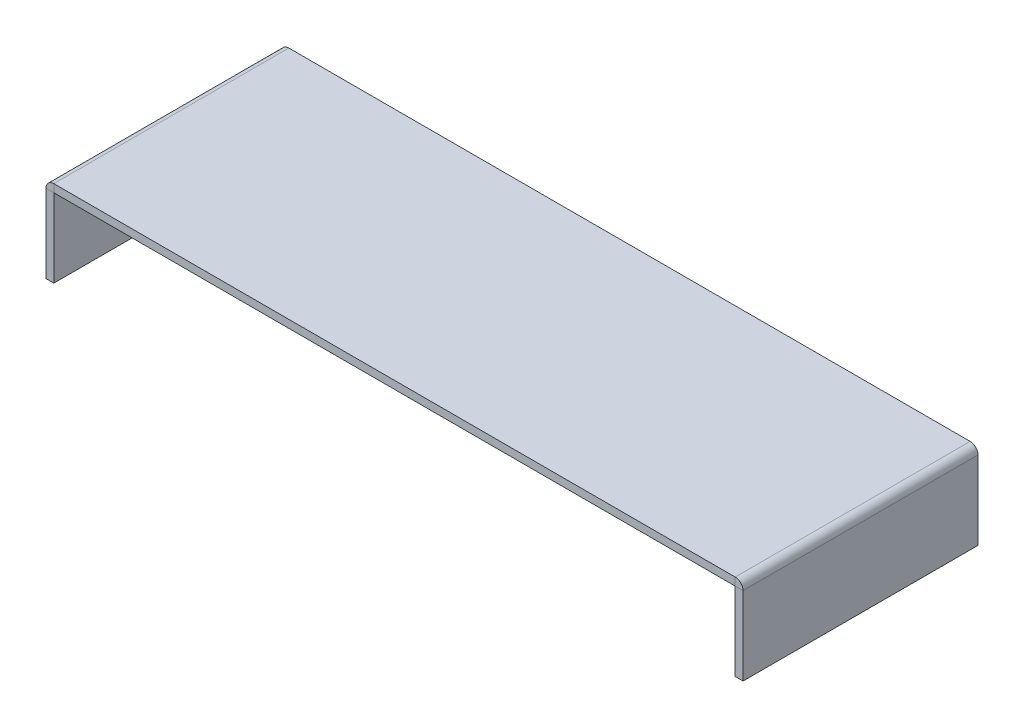
ISO-10303-21;
HEADER;
FILE_DESCRIPTION(('STEP AP214'),'2;1');
FILE_NAME('part.step','',(''),(''),'','','');
FILE_SCHEMA(('AUTOMOTIVE_DESIGN { 1 0 10303 214 1 1 1 1 }'));
ENDSEC;
DATA;
#1=APPLICATION_CONTEXT('core data for automotive mechanical design processes');
#2=APPLICATION_PROTOCOL_DEFINITION('international standard','automotive_design',2000,#1);
#3=PRODUCT_CONTEXT('',#1,'mechanical');
#4=PRODUCT('Part','Part','',(#3));
#5=PRODUCT_RELATED_PRODUCT_CATEGORY('part','',(#4));
#6=PRODUCT_DEFINITION_FORMATION('','',#4);
#7=PRODUCT_DEFINITION_CONTEXT('part definition',#1,'design');
#8=PRODUCT_DEFINITION('design','',#6,#7);
#9=PRODUCT_DEFINITION_SHAPE('','',#8);
#10=(LENGTH_UNIT() NAMED_UNIT(*) SI_UNIT(.MILLI.,.METRE.));
#11=(NAMED_UNIT(*) PLANE_ANGLE_UNIT() SI_UNIT($,.RADIAN.));
#12=(NAMED_UNIT(*) SI_UNIT($,.STERADIAN.) SOLID_ANGLE_UNIT());
#13=UNCERTAINTY_MEASURE_WITH_UNIT(LENGTH_MEASURE(1.E-05),#10,'distance_accuracy_value','');
#14=(GEOMETRIC_REPRESENTATION_CONTEXT(3) GLOBAL_UNCERTAINTY_ASSIGNED_CONTEXT((#13)) GLOBAL_UNIT_ASSIGNED_CONTEXT((#10,
#11,#12)) REPRESENTATION_CONTEXT('',''));
#15=CARTESIAN_POINT('',(0.,0.,0.));
#16=DIRECTION('',(0.,0.,1.));
#17=DIRECTION('',(1.,0.,0.));
#18=AXIS2_PLACEMENT_3D('',#15,#16,#17);
#19=CARTESIAN_POINT('',(43.5,0.,-15.));
#20=DIRECTION('',(0.,0.,-1.));
#21=DIRECTION('',(-1.,0.,0.));
#22=AXIS2_PLACEMENT_3D('',#19,#20,#21);
#23=PLANE('',#22);
#24=DIRECTION('',(0.,1.,0.));
#25=VECTOR('',#24,1.);
#26=CARTESIAN_POINT('',(43.5,0.,-15.));
#27=LINE('',#26,#25);
#28=CARTESIAN_POINT('',(43.5,0.,-15.));
#29=VERTEX_POINT('',#28);
#30=CARTESIAN_POINT('',(43.5,1.,-15.));
#31=VERTEX_POINT('',#30);
#32=EDGE_CURVE('E11',#29,#31,#27,.T.);
#33=ORIENTED_EDGE('',*,*,#32,.F.);
#34=DIRECTION('',(1.,0.,0.));
#35=VECTOR('',#34,1.);
#36=CARTESIAN_POINT('',(-43.5,0.,-15.));
#37=LINE('',#36,#35);
#38=CARTESIAN_POINT('',(-43.5,0.,-15.));
#39=VERTEX_POINT('',#38);
#40=EDGE_CURVE('E119',#39,#29,#37,.T.);
#41=ORIENTED_EDGE('',*,*,#40,.F.);
#42=DIRECTION('',(0.,1.,0.));
#43=VECTOR('',#42,1.);
#44=CARTESIAN_POINT('',(-43.5,0.,-15.));
#45=LINE('',#44,#43);
#46=CARTESIAN_POINT('',(-43.5,1.,-15.));
#47=VERTEX_POINT('',#46);
#48=EDGE_CURVE('E207',#39,#47,#45,.T.);
#49=ORIENTED_EDGE('',*,*,#48,.T.);
#50=DIRECTION('',(1.,0.,0.));
#51=VECTOR('',#50,1.);
#52=CARTESIAN_POINT('',(-43.5,1.,-15.));
#53=LINE('',#52,#51);
#54=EDGE_CURVE('E159',#47,#31,#53,.T.);
#55=ORIENTED_EDGE('',*,*,#54,.T.);
#56=EDGE_LOOP('',(#33,#41,#49,#55));
#57=FACE_BOUND('',#56,.T.);
#58=ADVANCED_FACE('F35',(#57),#23,.T.);
#59=CARTESIAN_POINT('',(43.5,0.,-15.));
#60=DIRECTION('',(0.,0.,-1.));
#61=DIRECTION('',(-1.,0.,0.));
#62=AXIS2_PLACEMENT_3D('',#59,#60,#61);
#63=PLANE('',#62);
#64=DIRECTION('',(1.,0.,0.));
#65=VECTOR('',#64,1.);
#66=CARTESIAN_POINT('',(43.5,0.,-15.));
#67=LINE('',#66,#65);
#68=CARTESIAN_POINT('',(44.5,0.,-15.));
#69=VERTEX_POINT('',#68);
#70=EDGE_CURVE('E42',#29,#69,#67,.T.);
#71=ORIENTED_EDGE('',*,*,#70,.F.);
#72=ORIENTED_EDGE('',*,*,#32,.T.);
#73=CARTESIAN_POINT('',(43.5,0.,-15.));
#74=DIRECTION('',(0.,0.,-1.));
#75=DIRECTION('',(-1.,0.,0.));
#76=AXIS2_PLACEMENT_3D('',#73,#74,#75);
#77=CIRCLE('',#76,1.);
#78=EDGE_CURVE('E184',#31,#69,#77,.T.);
#79=ORIENTED_EDGE('',*,*,#78,.T.);
#80=EDGE_LOOP('',(#71,#72,#79));
#81=FACE_BOUND('',#80,.T.);
#82=ADVANCED_FACE('F218',(#81),#63,.T.);
#83=CARTESIAN_POINT('',(43.5,0.,15.));
#84=DIRECTION('',(0.,0.,1.));
#85=DIRECTION('',(1.,0.,0.));
#86=AXIS2_PLACEMENT_3D('',#83,#84,#85);
#87=PLANE('',#86);
#88=DIRECTION('',(1.,0.,0.));
#89=VECTOR('',#88,1.);
#90=CARTESIAN_POINT('',(43.5,0.,15.));
#91=LINE('',#90,#89);
#92=CARTESIAN_POINT('',(43.5,0.,15.));
#93=VERTEX_POINT('',#92);
#94=CARTESIAN_POINT('',(44.5,0.,15.));
#95=VERTEX_POINT('',#94);
#96=EDGE_CURVE('E49',#93,#95,#91,.T.);
#97=ORIENTED_EDGE('',*,*,#96,.F.);
#98=DIRECTION('',(0.,-1.,0.));
#99=VECTOR('',#98,1.);
#100=CARTESIAN_POINT('',(43.5,0.,15.));
#101=LINE('',#100,#99);
#102=CARTESIAN_POINT('',(43.5,-10.,15.));
#103=VERTEX_POINT('',#102);
#104=EDGE_CURVE('E111',#93,#103,#101,.T.);
#105=ORIENTED_EDGE('',*,*,#104,.T.);
#106=DIRECTION('',(-1.,0.,0.));
#107=VECTOR('',#106,1.);
#108=CARTESIAN_POINT('',(44.5,-10.,15.));
#109=LINE('',#108,#107);
#110=CARTESIAN_POINT('',(44.5,-10.,15.));
#111=VERTEX_POINT('',#110);
#112=EDGE_CURVE('E116',#111,#103,#109,.T.);
#113=ORIENTED_EDGE('',*,*,#112,.F.);
#114=DIRECTION('',(0.,1.,0.));
#115=VECTOR('',#114,1.);
#116=CARTESIAN_POINT('',(44.5,0.,15.));
#117=LINE('',#116,#115);
#118=EDGE_CURVE('E135',#95,#111,#117,.F.);
#119=ORIENTED_EDGE('',*,*,#118,.F.);
#120=EDGE_LOOP('',(#97,#105,#113,#119));
#121=FACE_BOUND('',#120,.T.);
#122=ADVANCED_FACE('F113',(#121),#87,.T.);
#123=CARTESIAN_POINT('',(43.5,0.,15.));
#124=DIRECTION('',(0.,0.,1.));
#125=DIRECTION('',(1.,0.,0.));
#126=AXIS2_PLACEMENT_3D('',#123,#124,#125);
#127=PLANE('',#126);
#128=DIRECTION('',(0.,1.,0.));
#129=VECTOR('',#128,1.);
#130=CARTESIAN_POINT('',(43.5,0.,15.));
#131=LINE('',#130,#129);
#132=CARTESIAN_POINT('',(43.5,1.,15.));
#133=VERTEX_POINT('',#132);
#134=EDGE_CURVE('E56',#93,#133,#131,.T.);
#135=ORIENTED_EDGE('',*,*,#134,.F.);
#136=ORIENTED_EDGE('',*,*,#96,.T.);
#137=CARTESIAN_POINT('',(43.5,0.,15.));
#138=DIRECTION('',(0.,0.,-1.));
#139=DIRECTION('',(-1.,0.,0.));
#140=AXIS2_PLACEMENT_3D('',#137,#138,#139);
#141=CIRCLE('',#140,1.);
#142=EDGE_CURVE('E196',#95,#133,#141,.F.);
#143=ORIENTED_EDGE('',*,*,#142,.T.);
#144=EDGE_LOOP('',(#135,#136,#143));
#145=FACE_BOUND('',#144,.T.);
#146=ADVANCED_FACE('F226',(#145),#127,.T.);
#147=CARTESIAN_POINT('',(-43.5,0.,-15.));
#148=DIRECTION('',(0.,0.,-1.));
#149=DIRECTION('',(-1.,0.,0.));
#150=AXIS2_PLACEMENT_3D('',#147,#148,#149);
#151=PLANE('',#150);
#152=DIRECTION('',(-1.,0.,0.));
#153=VECTOR('',#152,1.);
#154=CARTESIAN_POINT('',(-43.5,0.,-15.));
#155=LINE('',#154,#153);
#156=CARTESIAN_POINT('',(-44.5,0.,-15.));
#157=VERTEX_POINT('',#156);
#158=EDGE_CURVE('E209',#39,#157,#155,.T.);
#159=ORIENTED_EDGE('',*,*,#158,.F.);
#160=DIRECTION('',(0.,1.,0.));
#161=VECTOR('',#160,1.);
#162=CARTESIAN_POINT('',(-43.5,0.,-15.));
#163=LINE('',#162,#161);
#164=CARTESIAN_POINT('',(-43.5,-10.,-15.));
#165=VERTEX_POINT('',#164);
#166=EDGE_CURVE('E168',#165,#39,#163,.T.);
#167=ORIENTED_EDGE('',*,*,#166,.F.);
#168=DIRECTION('',(-1.,0.,0.));
#169=VECTOR('',#168,1.);
#170=CARTESIAN_POINT('',(-43.5,-10.,-15.));
#171=LINE('',#170,#169);
#172=CARTESIAN_POINT('',(-44.5,-10.,-15.));
#173=VERTEX_POINT('',#172);
#174=EDGE_CURVE('E165',#165,#173,#171,.T.);
#175=ORIENTED_EDGE('',*,*,#174,.T.);
#176=DIRECTION('',(0.,1.,0.));
#177=VECTOR('',#176,1.);
#178=CARTESIAN_POINT('',(-44.5,0.,-15.));
#179=LINE('',#178,#177);
#180=EDGE_CURVE('E162',#173,#157,#179,.T.);
#181=ORIENTED_EDGE('',*,*,#180,.T.);
#182=EDGE_LOOP('',(#159,#167,#175,#181));
#183=FACE_BOUND('',#182,.T.);
#184=ADVANCED_FACE('F265',(#183),#151,.T.);
#185=CARTESIAN_POINT('',(-43.5,0.,-15.));
#186=DIRECTION('',(0.,0.,-1.));
#187=DIRECTION('',(-1.,0.,0.));
#188=AXIS2_PLACEMENT_3D('',#185,#186,#187);
#189=PLANE('',#188);
#190=ORIENTED_EDGE('',*,*,#48,.F.);
#191=ORIENTED_EDGE('',*,*,#158,.T.);
#192=CARTESIAN_POINT('',(-43.5,0.,-15.));
#193=DIRECTION('',(0.,0.,-1.));
#194=DIRECTION('',(-1.,0.,0.));
#195=AXIS2_PLACEMENT_3D('',#192,#193,#194);
#196=CIRCLE('',#195,1.);
#197=EDGE_CURVE('E187',#157,#47,#196,.T.);
#198=ORIENTED_EDGE('',*,*,#197,.T.);
#199=EDGE_LOOP('',(#190,#191,#198));
#200=FACE_BOUND('',#199,.T.);
#201=ADVANCED_FACE('F263',(#200),#189,.T.);
#202=CARTESIAN_POINT('',(-43.5,0.,15.));
#203=DIRECTION('',(0.,0.,1.));
#204=DIRECTION('',(1.,0.,0.));
#205=AXIS2_PLACEMENT_3D('',#202,#203,#204);
#206=PLANE('',#205);
#207=DIRECTION('',(0.,1.,0.));
#208=VECTOR('',#207,1.);
#209=CARTESIAN_POINT('',(-43.5,0.,15.));
#210=LINE('',#209,#208);
#211=CARTESIAN_POINT('',(-43.5,0.,15.));
#212=VERTEX_POINT('',#211);
#213=CARTESIAN_POINT('',(-43.5,1.,15.));
#214=VERTEX_POINT('',#213);
#215=EDGE_CURVE('E205',#212,#214,#210,.T.);
#216=ORIENTED_EDGE('',*,*,#215,.F.);
#217=DIRECTION('',(1.,0.,0.));
#218=VECTOR('',#217,1.);
#219=CARTESIAN_POINT('',(-43.5,0.,15.));
#220=LINE('',#219,#218);
#221=EDGE_CURVE('E151',#212,#93,#220,.T.);
#222=ORIENTED_EDGE('',*,*,#221,.T.);
#223=ORIENTED_EDGE('',*,*,#134,.T.);
#224=DIRECTION('',(1.,0.,0.));
#225=VECTOR('',#224,1.);
#226=CARTESIAN_POINT('',(-43.5,1.,15.));
#227=LINE('',#226,#225);
#228=EDGE_CURVE('E137',#214,#133,#227,.T.);
#229=ORIENTED_EDGE('',*,*,#228,.F.);
#230=EDGE_LOOP('',(#216,#222,#223,#229));
#231=FACE_BOUND('',#230,.T.);
#232=ADVANCED_FACE('F232',(#231),#206,.T.);
#233=CARTESIAN_POINT('',(-43.5,0.,15.));
#234=DIRECTION('',(0.,0.,1.));
#235=DIRECTION('',(1.,0.,0.));
#236=AXIS2_PLACEMENT_3D('',#233,#234,#235);
#237=PLANE('',#236);
#238=DIRECTION('',(-1.,0.,0.));
#239=VECTOR('',#238,1.);
#240=CARTESIAN_POINT('',(-43.5,0.,15.));
#241=LINE('',#240,#239);
#242=CARTESIAN_POINT('',(-44.5,0.,15.));
#243=VERTEX_POINT('',#242);
#244=EDGE_CURVE('E203',#212,#243,#241,.T.);
#245=ORIENTED_EDGE('',*,*,#244,.F.);
#246=ORIENTED_EDGE('',*,*,#215,.T.);
#247=CARTESIAN_POINT('',(-43.5,0.,15.));
#248=DIRECTION('',(0.,0.,-1.));
#249=DIRECTION('',(-1.,0.,0.));
#250=AXIS2_PLACEMENT_3D('',#247,#248,#249);
#251=CIRCLE('',#250,1.);
#252=EDGE_CURVE('E198',#214,#243,#251,.F.);
#253=ORIENTED_EDGE('',*,*,#252,.T.);
#254=EDGE_LOOP('',(#245,#246,#253));
#255=FACE_BOUND('',#254,.T.);
#256=ADVANCED_FACE('F239',(#255),#237,.T.);
#257=CARTESIAN_POINT('',(43.5,0.,15.));
#258=DIRECTION('',(1.,0.,0.));
#259=DIRECTION('',(0.,0.,-1.));
#260=AXIS2_PLACEMENT_3D('',#257,#258,#259);
#261=PLANE('',#260);
#262=DIRECTION('',(0.,-1.,0.));
#263=VECTOR('',#262,1.);
#264=CARTESIAN_POINT('',(43.5,0.,-15.));
#265=LINE('',#264,#263);
#266=CARTESIAN_POINT('',(43.5,-10.,-15.));
#267=VERTEX_POINT('',#266);
#268=EDGE_CURVE('E125',#29,#267,#265,.T.);
#269=ORIENTED_EDGE('',*,*,#268,.T.);
#270=DIRECTION('',(0.,0.,-1.));
#271=VECTOR('',#270,1.);
#272=CARTESIAN_POINT('',(43.5,-10.,15.));
#273=LINE('',#272,#271);
#274=EDGE_CURVE('E122',#103,#267,#273,.T.);
#275=ORIENTED_EDGE('',*,*,#274,.F.);
#276=ORIENTED_EDGE('',*,*,#104,.F.);
#277=DIRECTION('',(0.,0.,-1.));
#278=VECTOR('',#277,1.);
#279=CARTESIAN_POINT('',(43.5,0.,15.));
#280=LINE('',#279,#278);
#281=EDGE_CURVE('E153',#93,#29,#280,.T.);
#282=ORIENTED_EDGE('',*,*,#281,.T.);
#283=EDGE_LOOP('',(#269,#275,#276,#282));
#284=FACE_BOUND('',#283,.T.);
#285=ADVANCED_FACE('F123',(#284),#261,.F.);
#286=CARTESIAN_POINT('',(44.5,-10.,15.));
#287=DIRECTION('',(0.,-1.,0.));
#288=DIRECTION('',(0.,0.,-1.));
#289=AXIS2_PLACEMENT_3D('',#286,#287,#288);
#290=PLANE('',#289);
#291=DIRECTION('',(-1.,0.,0.));
#292=VECTOR('',#291,1.);
#293=CARTESIAN_POINT('',(44.5,-10.,-15.));
#294=LINE('',#293,#292);
#295=CARTESIAN_POINT('',(44.5,-10.,-15.));
#296=VERTEX_POINT('',#295);
#297=EDGE_CURVE('E155',#296,#267,#294,.T.);
#298=ORIENTED_EDGE('',*,*,#297,.F.);
#299=DIRECTION('',(0.,0.,-1.));
#300=VECTOR('',#299,1.);
#301=CARTESIAN_POINT('',(44.5,-10.,15.));
#302=LINE('',#301,#300);
#303=EDGE_CURVE('E130',#111,#296,#302,.T.);
#304=ORIENTED_EDGE('',*,*,#303,.F.);
#305=ORIENTED_EDGE('',*,*,#112,.T.);
#306=ORIENTED_EDGE('',*,*,#274,.T.);
#307=EDGE_LOOP('',(#298,#304,#305,#306));
#308=FACE_BOUND('',#307,.T.);
#309=ADVANCED_FACE('F133',(#308),#290,.T.);
#310=CARTESIAN_POINT('',(44.5,0.,15.));
#311=DIRECTION('',(1.,0.,0.));
#312=DIRECTION('',(0.,0.,-1.));
#313=AXIS2_PLACEMENT_3D('',#310,#311,#312);
#314=PLANE('',#313);
#315=DIRECTION('',(0.,1.,0.));
#316=VECTOR('',#315,1.);
#317=CARTESIAN_POINT('',(44.5,0.,-15.));
#318=LINE('',#317,#316);
#319=EDGE_CURVE('E157',#69,#296,#318,.F.);
#320=ORIENTED_EDGE('',*,*,#319,.F.);
#321=DIRECTION('',(0.,0.,-1.));
#322=VECTOR('',#321,1.);
#323=CARTESIAN_POINT('',(44.5,0.,15.));
#324=LINE('',#323,#322);
#325=EDGE_CURVE('E201',#69,#95,#324,.F.);
#326=ORIENTED_EDGE('',*,*,#325,.T.);
#327=ORIENTED_EDGE('',*,*,#118,.T.);
#328=ORIENTED_EDGE('',*,*,#303,.T.);
#329=EDGE_LOOP('',(#320,#326,#327,#328));
#330=FACE_BOUND('',#329,.T.);
#331=ADVANCED_FACE('F223',(#330),#314,.T.);
#332=CARTESIAN_POINT('',(-43.5,1.,15.));
#333=DIRECTION('',(0.,1.,0.));
#334=DIRECTION('',(0.,0.,1.));
#335=AXIS2_PLACEMENT_3D('',#332,#333,#334);
#336=PLANE('',#335);
#337=ORIENTED_EDGE('',*,*,#54,.F.);
#338=DIRECTION('',(0.,0.,-1.));
#339=VECTOR('',#338,1.);
#340=CARTESIAN_POINT('',(-43.5,1.,15.));
#341=LINE('',#340,#339);
#342=EDGE_CURVE('E193',#47,#214,#341,.F.);
#343=ORIENTED_EDGE('',*,*,#342,.T.);
#344=ORIENTED_EDGE('',*,*,#228,.T.);
#345=DIRECTION('',(0.,0.,-1.));
#346=VECTOR('',#345,1.);
#347=CARTESIAN_POINT('',(43.5,1.,15.));
#348=LINE('',#347,#346);
#349=EDGE_CURVE('E190',#133,#31,#348,.T.);
#350=ORIENTED_EDGE('',*,*,#349,.T.);
#351=EDGE_LOOP('',(#337,#343,#344,#350));
#352=FACE_BOUND('',#351,.T.);
#353=ADVANCED_FACE('F229',(#352),#336,.T.);
#354=CARTESIAN_POINT('',(-44.5,0.,15.));
#355=DIRECTION('',(-1.,0.,0.));
#356=DIRECTION('',(0.,0.,1.));
#357=AXIS2_PLACEMENT_3D('',#354,#355,#356);
#358=PLANE('',#357);
#359=DIRECTION('',(0.,1.,0.));
#360=VECTOR('',#359,1.);
#361=CARTESIAN_POINT('',(-44.5,0.,15.));
#362=LINE('',#361,#360);
#363=CARTESIAN_POINT('',(-44.5,-10.,15.));
#364=VERTEX_POINT('',#363);
#365=EDGE_CURVE('E142',#364,#243,#362,.T.);
#366=ORIENTED_EDGE('',*,*,#365,.T.);
#367=DIRECTION('',(0.,0.,-1.));
#368=VECTOR('',#367,1.);
#369=CARTESIAN_POINT('',(-44.5,0.,15.));
#370=LINE('',#369,#368);
#371=EDGE_CURVE('E129',#243,#157,#370,.T.);
#372=ORIENTED_EDGE('',*,*,#371,.T.);
#373=ORIENTED_EDGE('',*,*,#180,.F.);
#374=DIRECTION('',(0.,0.,-1.));
#375=VECTOR('',#374,1.);
#376=CARTESIAN_POINT('',(-44.5,-10.,15.));
#377=LINE('',#376,#375);
#378=EDGE_CURVE('E179',#364,#173,#377,.T.);
#379=ORIENTED_EDGE('',*,*,#378,.F.);
#380=EDGE_LOOP('',(#366,#372,#373,#379));
#381=FACE_BOUND('',#380,.T.);
#382=ADVANCED_FACE('F242',(#381),#358,.T.);
#383=CARTESIAN_POINT('',(-43.5,-10.,15.));
#384=DIRECTION('',(0.,-1.,0.));
#385=DIRECTION('',(0.,0.,-1.));
#386=AXIS2_PLACEMENT_3D('',#383,#384,#385);
#387=PLANE('',#386);
#388=ORIENTED_EDGE('',*,*,#174,.F.);
#389=DIRECTION('',(0.,0.,-1.));
#390=VECTOR('',#389,1.);
#391=CARTESIAN_POINT('',(-43.5,-10.,15.));
#392=LINE('',#391,#390);
#393=CARTESIAN_POINT('',(-43.5,-10.,15.));
#394=VERTEX_POINT('',#393);
#395=EDGE_CURVE('E177',#394,#165,#392,.T.);
#396=ORIENTED_EDGE('',*,*,#395,.F.);
#397=DIRECTION('',(-1.,0.,0.));
#398=VECTOR('',#397,1.);
#399=CARTESIAN_POINT('',(-43.5,-10.,15.));
#400=LINE('',#399,#398);
#401=EDGE_CURVE('E145',#394,#364,#400,.T.);
#402=ORIENTED_EDGE('',*,*,#401,.T.);
#403=ORIENTED_EDGE('',*,*,#378,.T.);
#404=EDGE_LOOP('',(#388,#396,#402,#403));
#405=FACE_BOUND('',#404,.T.);
#406=ADVANCED_FACE('F249',(#405),#387,.T.);
#407=CARTESIAN_POINT('',(-43.5,0.,15.));
#408=DIRECTION('',(-1.,0.,0.));
#409=DIRECTION('',(0.,0.,1.));
#410=AXIS2_PLACEMENT_3D('',#407,#408,#409);
#411=PLANE('',#410);
#412=ORIENTED_EDGE('',*,*,#166,.T.);
#413=DIRECTION('',(0.,0.,-1.));
#414=VECTOR('',#413,1.);
#415=CARTESIAN_POINT('',(-43.5,0.,15.));
#416=LINE('',#415,#414);
#417=EDGE_CURVE('E174',#212,#39,#416,.T.);
#418=ORIENTED_EDGE('',*,*,#417,.F.);
#419=DIRECTION('',(0.,1.,0.));
#420=VECTOR('',#419,1.);
#421=CARTESIAN_POINT('',(-43.5,0.,15.));
#422=LINE('',#421,#420);
#423=EDGE_CURVE('E148',#394,#212,#422,.T.);
#424=ORIENTED_EDGE('',*,*,#423,.F.);
#425=ORIENTED_EDGE('',*,*,#395,.T.);
#426=EDGE_LOOP('',(#412,#418,#424,#425));
#427=FACE_BOUND('',#426,.T.);
#428=ADVANCED_FACE('F254',(#427),#411,.F.);
#429=CARTESIAN_POINT('',(-43.5,0.,15.));
#430=DIRECTION('',(0.,1.,0.));
#431=DIRECTION('',(0.,0.,1.));
#432=AXIS2_PLACEMENT_3D('',#429,#430,#431);
#433=PLANE('',#432);
#434=ORIENTED_EDGE('',*,*,#40,.T.);
#435=ORIENTED_EDGE('',*,*,#281,.F.);
#436=ORIENTED_EDGE('',*,*,#221,.F.);
#437=ORIENTED_EDGE('',*,*,#417,.T.);
#438=EDGE_LOOP('',(#434,#435,#436,#437));
#439=FACE_BOUND('',#438,.T.);
#440=ADVANCED_FACE('F259',(#439),#433,.F.);
#441=CARTESIAN_POINT('',(0.,0.,15.));
#442=DIRECTION('',(0.,0.,-1.));
#443=DIRECTION('',(-1.,0.,0.));
#444=AXIS2_PLACEMENT_3D('',#441,#442,#443);
#445=PLANE('',#444);
#446=ORIENTED_EDGE('',*,*,#423,.T.);
#447=ORIENTED_EDGE('',*,*,#244,.T.);
#448=ORIENTED_EDGE('',*,*,#365,.F.);
#449=ORIENTED_EDGE('',*,*,#401,.F.);
#450=EDGE_LOOP('',(#446,#447,#448,#449));
#451=FACE_BOUND('',#450,.T.);
#452=ADVANCED_FACE('F246',(#451),#445,.F.);
#453=CARTESIAN_POINT('',(0.,0.,-15.));
#454=DIRECTION('',(0.,0.,-1.));
#455=DIRECTION('',(-1.,0.,0.));
#456=AXIS2_PLACEMENT_3D('',#453,#454,#455);
#457=PLANE('',#456);
#458=ORIENTED_EDGE('',*,*,#268,.F.);
#459=ORIENTED_EDGE('',*,*,#70,.T.);
#460=ORIENTED_EDGE('',*,*,#319,.T.);
#461=ORIENTED_EDGE('',*,*,#297,.T.);
#462=EDGE_LOOP('',(#458,#459,#460,#461));
#463=FACE_BOUND('',#462,.T.);
#464=ADVANCED_FACE('F214',(#463),#457,.T.);
#465=CARTESIAN_POINT('',(-43.5,0.,15.));
#466=DIRECTION('',(0.,0.,-1.));
#467=DIRECTION('',(-1.,0.,0.));
#468=AXIS2_PLACEMENT_3D('',#465,#466,#467);
#469=CYLINDRICAL_SURFACE('',#468,1.);
#470=ORIENTED_EDGE('',*,*,#252,.F.);
#471=ORIENTED_EDGE('',*,*,#342,.F.);
#472=ORIENTED_EDGE('',*,*,#197,.F.);
#473=ORIENTED_EDGE('',*,*,#371,.F.);
#474=EDGE_LOOP('',(#470,#471,#472,#473));
#475=FACE_BOUND('',#474,.T.);
#476=ADVANCED_FACE('F236',(#475),#469,.T.);
#477=CARTESIAN_POINT('',(43.5,0.,15.));
#478=DIRECTION('',(0.,0.,-1.));
#479=DIRECTION('',(-1.,0.,0.));
#480=AXIS2_PLACEMENT_3D('',#477,#478,#479);
#481=CYLINDRICAL_SURFACE('',#480,1.);
#482=ORIENTED_EDGE('',*,*,#142,.F.);
#483=ORIENTED_EDGE('',*,*,#325,.F.);
#484=ORIENTED_EDGE('',*,*,#78,.F.);
#485=ORIENTED_EDGE('',*,*,#349,.F.);
#486=EDGE_LOOP('',(#482,#483,#484,#485));
#487=FACE_BOUND('',#486,.T.);
#488=ADVANCED_FACE('F225',(#487),#481,.T.);
#489=CLOSED_SHELL('',(#58,#82,#122,#146,#184,#201,#232,#256,#285,#309,#331,#353,#382,#406,#428,
#440,#452,#464,#476,#488));
#490=MANIFOLD_SOLID_BREP('B2',#489);
#491=ADVANCED_BREP_SHAPE_REPRESENTATION('',(#18,#490),#14);
#492=SHAPE_DEFINITION_REPRESENTATION(#9,#491);
ENDSEC;
END-ISO-10303-21;
